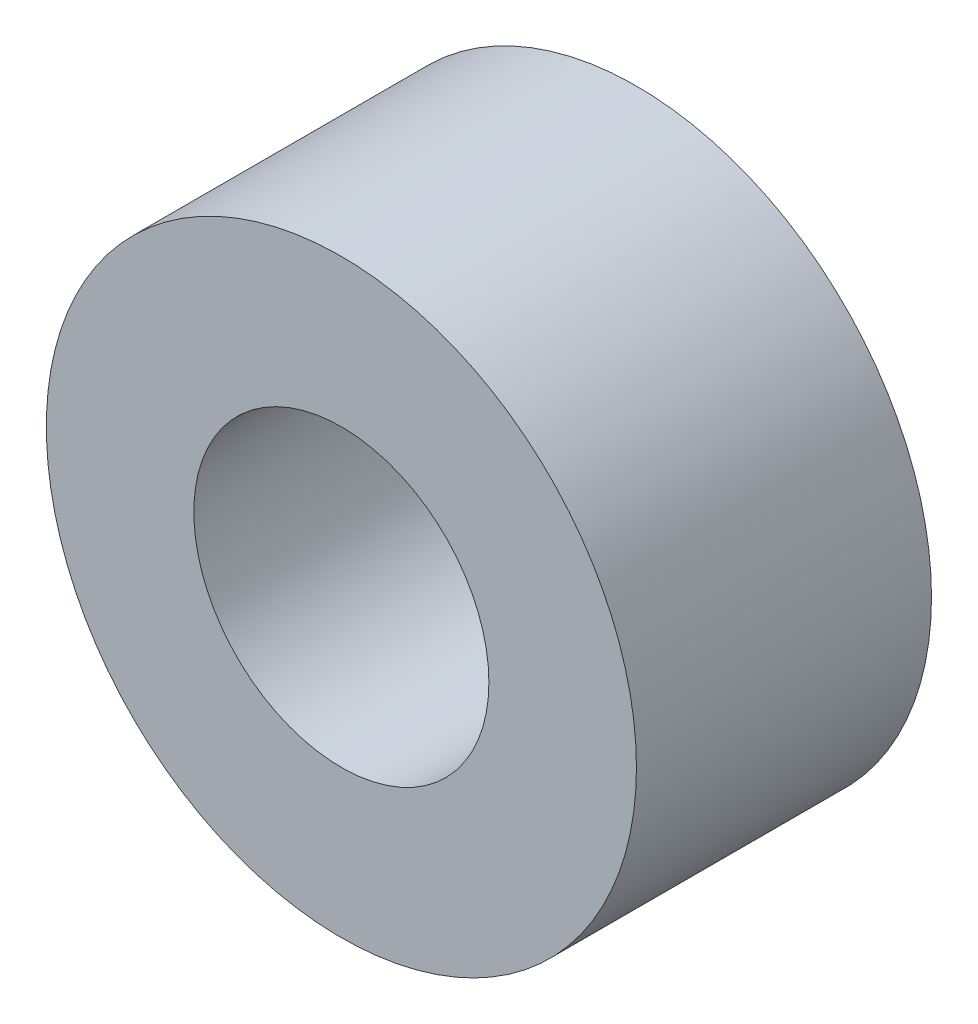
ISO-10303-21;
HEADER;
FILE_DESCRIPTION(('STEP AP214'),'2;1');
FILE_NAME('part.step','',(''),(''),'','','');
FILE_SCHEMA(('AUTOMOTIVE_DESIGN { 1 0 10303 214 1 1 1 1 }'));
ENDSEC;
DATA;
#1=APPLICATION_CONTEXT('core data for automotive mechanical design processes');
#2=APPLICATION_PROTOCOL_DEFINITION('international standard','automotive_design',2000,#1);
#3=PRODUCT_CONTEXT('',#1,'mechanical');
#4=PRODUCT('Part','Part','',(#3));
#5=PRODUCT_RELATED_PRODUCT_CATEGORY('part','',(#4));
#6=PRODUCT_DEFINITION_FORMATION('','',#4);
#7=PRODUCT_DEFINITION_CONTEXT('part definition',#1,'design');
#8=PRODUCT_DEFINITION('design','',#6,#7);
#9=PRODUCT_DEFINITION_SHAPE('','',#8);
#10=(LENGTH_UNIT() NAMED_UNIT(*) SI_UNIT(.MILLI.,.METRE.));
#11=(NAMED_UNIT(*) PLANE_ANGLE_UNIT() SI_UNIT($,.RADIAN.));
#12=(NAMED_UNIT(*) SI_UNIT($,.STERADIAN.) SOLID_ANGLE_UNIT());
#13=UNCERTAINTY_MEASURE_WITH_UNIT(LENGTH_MEASURE(1.E-05),#10,'distance_accuracy_value','');
#14=(GEOMETRIC_REPRESENTATION_CONTEXT(3) GLOBAL_UNCERTAINTY_ASSIGNED_CONTEXT((#13)) GLOBAL_UNIT_ASSIGNED_CONTEXT((#10,
#11,#12)) REPRESENTATION_CONTEXT('',''));
#15=CARTESIAN_POINT('',(0.,0.,0.));
#16=DIRECTION('',(0.,0.,1.));
#17=DIRECTION('',(1.,0.,0.));
#18=AXIS2_PLACEMENT_3D('',#15,#16,#17);
#19=CARTESIAN_POINT('',(0.,0.,6.35));
#20=DIRECTION('',(0.,0.,1.));
#21=DIRECTION('',(1.,0.,0.));
#22=AXIS2_PLACEMENT_3D('',#19,#20,#21);
#23=PLANE('',#22);
#24=CARTESIAN_POINT('',(0.,0.,6.35));
#25=DIRECTION('',(0.,0.,1.));
#26=DIRECTION('',(1.,0.,0.));
#27=AXIS2_PLACEMENT_3D('',#24,#25,#26);
#28=CIRCLE('',#27,6.35);
#29=CARTESIAN_POINT('',(6.35,0.,6.35));
#30=VERTEX_POINT('',#29);
#31=EDGE_CURVE('E10',#30,#30,#28,.T.);
#32=ORIENTED_EDGE('',*,*,#31,.T.);
#33=EDGE_LOOP('',(#32));
#34=FACE_BOUND('',#33,.T.);
#35=CARTESIAN_POINT('',(0.,0.,6.35));
#36=DIRECTION('',(0.,0.,1.));
#37=DIRECTION('',(1.,0.,0.));
#38=AXIS2_PLACEMENT_3D('',#35,#36,#37);
#39=CIRCLE('',#38,3.175);
#40=CARTESIAN_POINT('',(3.175,0.,6.35));
#41=VERTEX_POINT('',#40);
#42=EDGE_CURVE('E42',#41,#41,#39,.T.);
#43=ORIENTED_EDGE('',*,*,#42,.F.);
#44=EDGE_LOOP('',(#43));
#45=FACE_BOUND('',#44,.T.);
#46=ADVANCED_FACE('F31',(#34,#45),#23,.T.);
#47=CARTESIAN_POINT('',(0.,0.,0.));
#48=DIRECTION('',(0.,0.,1.));
#49=DIRECTION('',(1.,0.,0.));
#50=AXIS2_PLACEMENT_3D('',#47,#48,#49);
#51=PLANE('',#50);
#52=CARTESIAN_POINT('',(0.,0.,0.));
#53=DIRECTION('',(0.,0.,1.));
#54=DIRECTION('',(1.,0.,0.));
#55=AXIS2_PLACEMENT_3D('',#52,#53,#54);
#56=CIRCLE('',#55,6.35);
#57=CARTESIAN_POINT('',(6.35,0.,0.));
#58=VERTEX_POINT('',#57);
#59=EDGE_CURVE('E35',#58,#58,#56,.T.);
#60=ORIENTED_EDGE('',*,*,#59,.F.);
#61=EDGE_LOOP('',(#60));
#62=FACE_BOUND('',#61,.T.);
#63=CARTESIAN_POINT('',(0.,0.,0.));
#64=DIRECTION('',(0.,0.,1.));
#65=DIRECTION('',(1.,0.,0.));
#66=AXIS2_PLACEMENT_3D('',#63,#64,#65);
#67=CIRCLE('',#66,3.175);
#68=CARTESIAN_POINT('',(3.175,0.,0.));
#69=VERTEX_POINT('',#68);
#70=EDGE_CURVE('E44',#69,#69,#67,.T.);
#71=ORIENTED_EDGE('',*,*,#70,.T.);
#72=EDGE_LOOP('',(#71));
#73=FACE_BOUND('',#72,.T.);
#74=ADVANCED_FACE('F54',(#62,#73),#51,.F.);
#75=CARTESIAN_POINT('',(0.,0.,6.35));
#76=DIRECTION('',(0.,0.,-1.));
#77=DIRECTION('',(-1.,0.,0.));
#78=AXIS2_PLACEMENT_3D('',#75,#76,#77);
#79=CYLINDRICAL_SURFACE('',#78,6.35);
#80=ORIENTED_EDGE('',*,*,#31,.F.);
#81=EDGE_LOOP('',(#80));
#82=FACE_BOUND('',#81,.T.);
#83=ORIENTED_EDGE('',*,*,#59,.T.);
#84=EDGE_LOOP('',(#83));
#85=FACE_BOUND('',#84,.T.);
#86=ADVANCED_FACE('F33',(#82,#85),#79,.T.);
#87=CARTESIAN_POINT('',(0.,0.,6.35));
#88=DIRECTION('',(0.,0.,-1.));
#89=DIRECTION('',(-1.,0.,0.));
#90=AXIS2_PLACEMENT_3D('',#87,#88,#89);
#91=CYLINDRICAL_SURFACE('',#90,3.175);
#92=ORIENTED_EDGE('',*,*,#42,.T.);
#93=EDGE_LOOP('',(#92));
#94=FACE_BOUND('',#93,.T.);
#95=ORIENTED_EDGE('',*,*,#70,.F.);
#96=EDGE_LOOP('',(#95));
#97=FACE_BOUND('',#96,.T.);
#98=ADVANCED_FACE('F50',(#94,#97),#91,.F.);
#99=CLOSED_SHELL('',(#46,#74,#86,#98));
#100=MANIFOLD_SOLID_BREP('B2',#99);
#101=ADVANCED_BREP_SHAPE_REPRESENTATION('',(#18,#100),#14);
#102=SHAPE_DEFINITION_REPRESENTATION(#9,#101);
ENDSEC;
END-ISO-10303-21;
